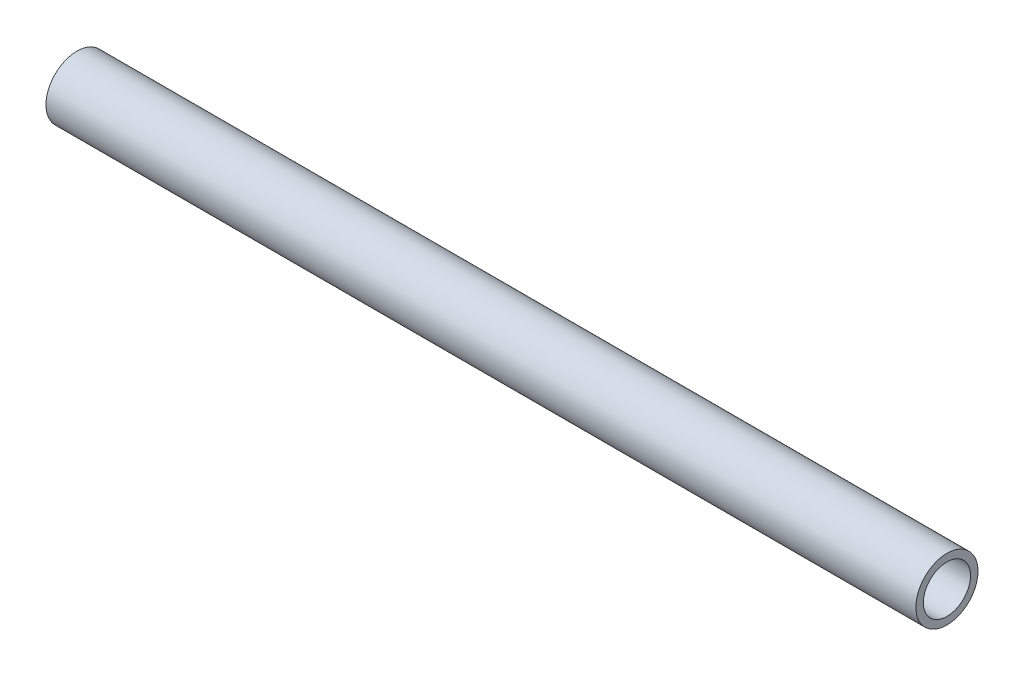
ISO-10303-21;
HEADER;
FILE_DESCRIPTION(('STEP AP214'),'2;1');
FILE_NAME('part.step','',(''),(''),'','','');
FILE_SCHEMA(('AUTOMOTIVE_DESIGN { 1 0 10303 214 1 1 1 1 }'));
ENDSEC;
DATA;
#1=APPLICATION_CONTEXT('core data for automotive mechanical design processes');
#2=APPLICATION_PROTOCOL_DEFINITION('international standard','automotive_design',2000,#1);
#3=PRODUCT_CONTEXT('',#1,'mechanical');
#4=PRODUCT('Part','Part','',(#3));
#5=PRODUCT_RELATED_PRODUCT_CATEGORY('part','',(#4));
#6=PRODUCT_DEFINITION_FORMATION('','',#4);
#7=PRODUCT_DEFINITION_CONTEXT('part definition',#1,'design');
#8=PRODUCT_DEFINITION('design','',#6,#7);
#9=PRODUCT_DEFINITION_SHAPE('','',#8);
#10=(LENGTH_UNIT() NAMED_UNIT(*) SI_UNIT(.MILLI.,.METRE.));
#11=(NAMED_UNIT(*) PLANE_ANGLE_UNIT() SI_UNIT($,.RADIAN.));
#12=(NAMED_UNIT(*) SI_UNIT($,.STERADIAN.) SOLID_ANGLE_UNIT());
#13=UNCERTAINTY_MEASURE_WITH_UNIT(LENGTH_MEASURE(1.E-05),#10,'distance_accuracy_value','');
#14=(GEOMETRIC_REPRESENTATION_CONTEXT(3) GLOBAL_UNCERTAINTY_ASSIGNED_CONTEXT((#13)) GLOBAL_UNIT_ASSIGNED_CONTEXT((#10,
#11,#12)) REPRESENTATION_CONTEXT('',''));
#15=CARTESIAN_POINT('',(0.,0.,0.));
#16=DIRECTION('',(0.,0.,1.));
#17=DIRECTION('',(1.,0.,0.));
#18=AXIS2_PLACEMENT_3D('',#15,#16,#17);
#19=CARTESIAN_POINT('',(355.6,0.,0.));
#20=DIRECTION('',(1.,0.,0.));
#21=DIRECTION('',(0.,0.,-1.));
#22=AXIS2_PLACEMENT_3D('',#19,#20,#21);
#23=PLANE('',#22);
#24=CARTESIAN_POINT('',(355.6,0.,0.));
#25=DIRECTION('',(1.,0.,0.));
#26=DIRECTION('',(0.,0.,-1.));
#27=AXIS2_PLACEMENT_3D('',#24,#25,#26);
#28=CIRCLE('',#27,12.7);
#29=CARTESIAN_POINT('',(355.6,0.,-12.7));
#30=VERTEX_POINT('',#29);
#31=EDGE_CURVE('E10',#30,#30,#28,.T.);
#32=ORIENTED_EDGE('',*,*,#31,.T.);
#33=EDGE_LOOP('',(#32));
#34=FACE_BOUND('',#33,.T.);
#35=CARTESIAN_POINT('',(355.6,0.,0.));
#36=DIRECTION('',(1.,0.,0.));
#37=DIRECTION('',(0.,0.,-1.));
#38=AXIS2_PLACEMENT_3D('',#35,#36,#37);
#39=CIRCLE('',#38,9.652);
#40=CARTESIAN_POINT('',(355.6,0.,-9.652));
#41=VERTEX_POINT('',#40);
#42=EDGE_CURVE('E46',#41,#41,#39,.T.);
#43=ORIENTED_EDGE('',*,*,#42,.F.);
#44=EDGE_LOOP('',(#43));
#45=FACE_BOUND('',#44,.T.);
#46=ADVANCED_FACE('F32',(#34,#45),#23,.T.);
#47=CARTESIAN_POINT('',(0.,0.,0.));
#48=DIRECTION('',(1.,0.,0.));
#49=DIRECTION('',(0.,0.,-1.));
#50=AXIS2_PLACEMENT_3D('',#47,#48,#49);
#51=PLANE('',#50);
#52=CARTESIAN_POINT('',(0.,0.,0.));
#53=DIRECTION('',(1.,0.,0.));
#54=DIRECTION('',(0.,0.,-1.));
#55=AXIS2_PLACEMENT_3D('',#52,#53,#54);
#56=CIRCLE('',#55,12.7);
#57=CARTESIAN_POINT('',(0.,0.,-12.7));
#58=VERTEX_POINT('',#57);
#59=EDGE_CURVE('E36',#58,#58,#56,.T.);
#60=ORIENTED_EDGE('',*,*,#59,.F.);
#61=EDGE_LOOP('',(#60));
#62=FACE_BOUND('',#61,.T.);
#63=CARTESIAN_POINT('',(0.,0.,0.));
#64=DIRECTION('',(1.,0.,0.));
#65=DIRECTION('',(0.,0.,-1.));
#66=AXIS2_PLACEMENT_3D('',#63,#64,#65);
#67=CIRCLE('',#66,9.652);
#68=CARTESIAN_POINT('',(0.,0.,-9.652));
#69=VERTEX_POINT('',#68);
#70=EDGE_CURVE('E48',#69,#69,#67,.T.);
#71=ORIENTED_EDGE('',*,*,#70,.T.);
#72=EDGE_LOOP('',(#71));
#73=FACE_BOUND('',#72,.T.);
#74=ADVANCED_FACE('F59',(#62,#73),#51,.F.);
#75=CARTESIAN_POINT('',(355.6,0.,0.));
#76=DIRECTION('',(-1.,0.,0.));
#77=DIRECTION('',(0.,0.,1.));
#78=AXIS2_PLACEMENT_3D('',#75,#76,#77);
#79=CYLINDRICAL_SURFACE('',#78,12.7);
#80=ORIENTED_EDGE('',*,*,#31,.F.);
#81=EDGE_LOOP('',(#80));
#82=FACE_BOUND('',#81,.T.);
#83=ORIENTED_EDGE('',*,*,#59,.T.);
#84=EDGE_LOOP('',(#83));
#85=FACE_BOUND('',#84,.T.);
#86=ADVANCED_FACE('F34',(#82,#85),#79,.T.);
#87=CARTESIAN_POINT('',(355.6,0.,0.));
#88=DIRECTION('',(-1.,0.,0.));
#89=DIRECTION('',(0.,0.,1.));
#90=AXIS2_PLACEMENT_3D('',#87,#88,#89);
#91=CYLINDRICAL_SURFACE('',#90,9.652);
#92=ORIENTED_EDGE('',*,*,#42,.T.);
#93=EDGE_LOOP('',(#92));
#94=FACE_BOUND('',#93,.T.);
#95=ORIENTED_EDGE('',*,*,#70,.F.);
#96=EDGE_LOOP('',(#95));
#97=FACE_BOUND('',#96,.T.);
#98=ADVANCED_FACE('F55',(#94,#97),#91,.F.);
#99=CLOSED_SHELL('',(#46,#74,#86,#98));
#100=MANIFOLD_SOLID_BREP('B2',#99);
#101=ADVANCED_BREP_SHAPE_REPRESENTATION('',(#18,#100),#14);
#102=SHAPE_DEFINITION_REPRESENTATION(#9,#101);
ENDSEC;
END-ISO-10303-21;
